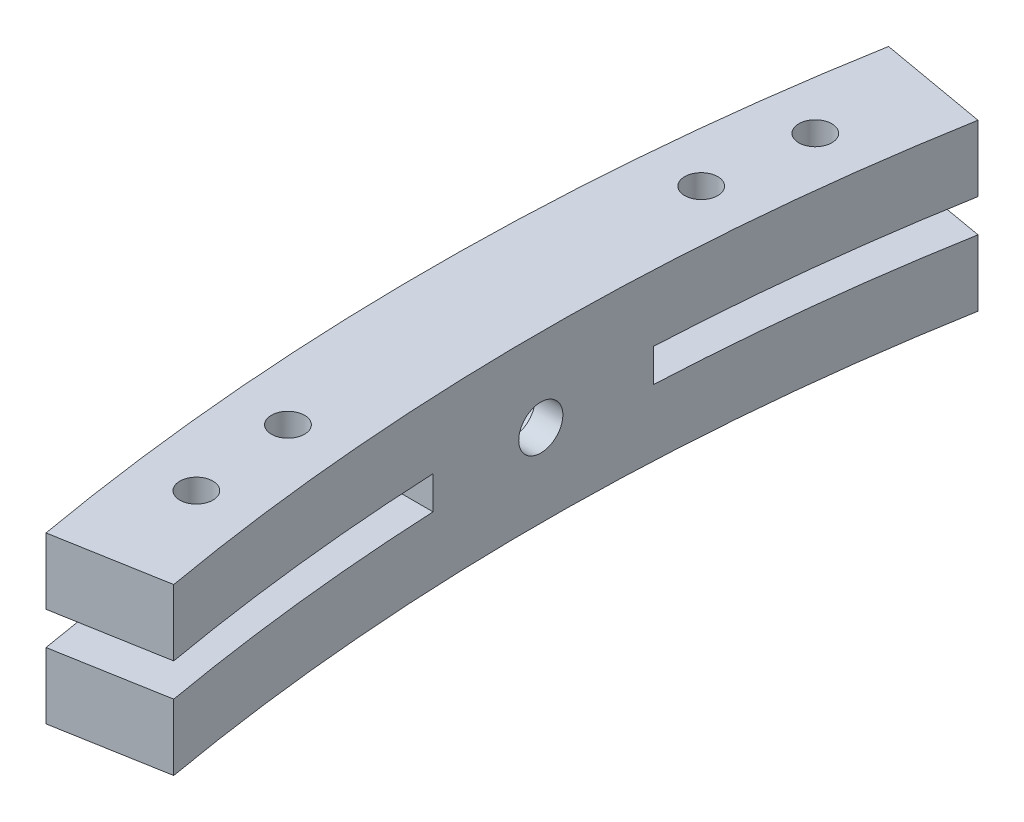
ISO-10303-21;
HEADER;
FILE_DESCRIPTION(('STEP AP214'),'2;1');
FILE_NAME('part.step','',(''),(''),'','','');
FILE_SCHEMA(('AUTOMOTIVE_DESIGN { 1 0 10303 214 1 1 1 1 }'));
ENDSEC;
DATA;
#1=APPLICATION_CONTEXT('core data for automotive mechanical design processes');
#2=APPLICATION_PROTOCOL_DEFINITION('international standard','automotive_design',2000,#1);
#3=PRODUCT_CONTEXT('',#1,'mechanical');
#4=PRODUCT('Part','Part','',(#3));
#5=PRODUCT_RELATED_PRODUCT_CATEGORY('part','',(#4));
#6=PRODUCT_DEFINITION_FORMATION('','',#4);
#7=PRODUCT_DEFINITION_CONTEXT('part definition',#1,'design');
#8=PRODUCT_DEFINITION('design','',#6,#7);
#9=PRODUCT_DEFINITION_SHAPE('','',#8);
#10=(LENGTH_UNIT() NAMED_UNIT(*) SI_UNIT(.MILLI.,.METRE.));
#11=(NAMED_UNIT(*) PLANE_ANGLE_UNIT() SI_UNIT($,.RADIAN.));
#12=(NAMED_UNIT(*) SI_UNIT($,.STERADIAN.) SOLID_ANGLE_UNIT());
#13=UNCERTAINTY_MEASURE_WITH_UNIT(LENGTH_MEASURE(1.E-05),#10,'distance_accuracy_value','');
#14=(GEOMETRIC_REPRESENTATION_CONTEXT(3) GLOBAL_UNCERTAINTY_ASSIGNED_CONTEXT((#13)) GLOBAL_UNIT_ASSIGNED_CONTEXT((#10,
#11,#12)) REPRESENTATION_CONTEXT('',''));
#15=CARTESIAN_POINT('',(0.,0.,0.));
#16=DIRECTION('',(0.,0.,1.));
#17=DIRECTION('',(1.,0.,0.));
#18=AXIS2_PLACEMENT_3D('',#15,#16,#17);
#19=CARTESIAN_POINT('',(-206.809628132564,0.,0.));
#20=DIRECTION('',(-1.,0.,0.));
#21=DIRECTION('',(0.,0.,1.));
#22=AXIS2_PLACEMENT_3D('',#19,#20,#21);
#23=CYLINDRICAL_SURFACE('',#22,2.);
#24=CARTESIAN_POINT('',(-209.990475974507,0.,2.));
#25=CARTESIAN_POINT('',(-209.990476103288,0.112338144724667,1.99999501923187));
#26=CARTESIAN_POINT('',(-209.990567088491,0.224757680341208,1.99050334589177));
#27=CARTESIAN_POINT('',(-209.990921298249,0.44650047140939,1.95277099718324));
#28=CARTESIAN_POINT('',(-209.991184729956,0.555819837775476,1.92450777179201));
#29=CARTESIAN_POINT('',(-209.991853987858,0.768117717352412,1.85003714892444));
#30=CARTESIAN_POINT('',(-209.992259745865,0.871099239304149,1.80383834326234));
#31=CARTESIAN_POINT('',(-209.993167847768,1.06781566271735,1.69481982844648));
#32=CARTESIAN_POINT('',(-209.993670167683,1.16155285127975,1.632004244612));
#33=CARTESIAN_POINT('',(-209.994714901786,1.33716547300706,1.49152048490637));
#34=CARTESIAN_POINT('',(-209.995257321297,1.41903932721294,1.41385033514174));
#35=CARTESIAN_POINT('',(-209.996321070344,1.56858847588184,1.24586395594507));
#36=CARTESIAN_POINT('',(-209.99684239905,1.63626321196187,1.15554722941682));
#37=CARTESIAN_POINT('',(-209.997805168152,1.75548929937188,0.964833609456509));
#38=CARTESIAN_POINT('',(-209.998246608519,1.80704064485505,0.864436712369089));
#39=CARTESIAN_POINT('',(-209.998999830737,1.8925561649259,0.656412867654744));
#40=CARTESIAN_POINT('',(-209.999311612874,1.92652037841772,0.548785936021828));
#41=CARTESIAN_POINT('',(-209.999770361235,1.97589670512903,0.329360353643706));
#42=CARTESIAN_POINT('',(-209.999917332212,1.99130935359541,0.21756182335278));
#43=CARTESIAN_POINT('',(-210.000029904476,2.0031466569911,-0.00703586417104369));
#44=CARTESIAN_POINT('',(-209.999995506128,1.9995713503242,-0.119835019379682));
#45=CARTESIAN_POINT('',(-209.999749222785,1.97353478375664,-0.343228310351627));
#46=CARTESIAN_POINT('',(-209.999537343485,1.95107412981574,-0.453822516746895));
#47=CARTESIAN_POINT('',(-209.998959991412,1.88790536605931,-0.669670442844306));
#48=CARTESIAN_POINT('',(-209.998594518459,1.84719723487059,-0.77492415629099));
#49=CARTESIAN_POINT('',(-209.997751172224,1.74868840391252,-0.977105087984566));
#50=CARTESIAN_POINT('',(-209.997273297124,1.69088742769442,-1.07403217152914));
#51=CARTESIAN_POINT('',(-209.99625902137,1.55983393215372,-1.25680687066725));
#52=CARTESIAN_POINT('',(-209.995722620723,1.48658141489486,-1.34265448774057));
#53=CARTESIAN_POINT('',(-209.994651741146,1.32670076455301,-1.50083691875616));
#54=CARTESIAN_POINT('',(-209.994117262293,1.24007209867148,-1.57317119418147));
#55=CARTESIAN_POINT('',(-209.9931105061,1.0559001501441,-1.70226945291759));
#56=CARTESIAN_POINT('',(-209.992638228767,0.958356866042596,-1.75903343415182));
#57=CARTESIAN_POINT('',(-209.991809123657,0.755124362536577,-1.85537966887152));
#58=CARTESIAN_POINT('',(-209.991452295982,0.649435135854338,-1.89496190700633));
#59=CARTESIAN_POINT('',(-209.990894325096,0.432911079394529,-1.95582069791133));
#60=CARTESIAN_POINT('',(-209.990693181835,0.32207625123683,-1.97709725644425));
#61=CARTESIAN_POINT('',(-209.99046926513,0.0984119228020425,-2.00074005741272));
#62=CARTESIAN_POINT('',(-209.990446484678,-0.0144174989180951,-2.0031070429451));
#63=CARTESIAN_POINT('',(-209.990581843633,-0.238872229036356,-1.98886544114253));
#64=CARTESIAN_POINT('',(-209.990739983027,-0.350497537526149,-1.97225685525221));
#65=CARTESIAN_POINT('',(-209.991219346535,-0.569373267640925,-1.92053619110991));
#66=CARTESIAN_POINT('',(-209.991540567689,-0.676623768615336,-1.8854244486256));
#67=CARTESIAN_POINT('',(-209.992309877271,-0.883707785503045,-1.79769453414193));
#68=CARTESIAN_POINT('',(-209.99275796571,-0.983541300779398,-1.74507636063919));
#69=CARTESIAN_POINT('',(-209.993730508996,-1.17296080105573,-1.62382534240781));
#70=CARTESIAN_POINT('',(-209.994254966224,-1.26254646648596,-1.55519199846361));
#71=CARTESIAN_POINT('',(-209.995321110871,-1.42892402505123,-1.40385963900143));
#72=CARTESIAN_POINT('',(-209.995862798301,-1.50571591024363,-1.32116061475126));
#73=CARTESIAN_POINT('',(-209.996902353189,-1.6443284696106,-1.14404128468044));
#74=CARTESIAN_POINT('',(-209.997400219233,-1.7061486607081,-1.04962060079706));
#75=CARTESIAN_POINT('',(-209.998295980995,-1.81305958966895,-0.851740304049286));
#76=CARTESIAN_POINT('',(-209.99869387683,-1.85815034721909,-0.748280701821836));
#77=CARTESIAN_POINT('',(-209.999344832952,-1.93032164857358,-0.535261248056988));
#78=CARTESIAN_POINT('',(-209.999597895796,-1.95740251045758,-0.425701504293564));
#79=CARTESIAN_POINT('',(-209.999930665911,-1.9927863528557,-0.20359011662296));
#80=CARTESIAN_POINT('',(-210.000010372916,-2.00108930459758,-0.0910384681317369));
#81=CARTESIAN_POINT('',(-209.999987444478,-1.99868151517294,0.133856563992748));
#82=CARTESIAN_POINT('',(-209.999884816589,-1.98797156168879,0.246199956060809));
#83=CARTESIAN_POINT('',(-209.99950880268,-1.9478435448965,0.467494268922846));
#84=CARTESIAN_POINT('',(-209.999235416317,-1.91842544401415,0.576445182902772));
#85=CARTESIAN_POINT('',(-209.9985486987,-1.84171571347673,0.787863607565823));
#86=CARTESIAN_POINT('',(-209.998135364851,-1.79442375244774,0.890330998006005));
#87=CARTESIAN_POINT('',(-209.997215368816,-1.68331083924546,1.08586790640008));
#88=CARTESIAN_POINT('',(-209.996708710266,-1.61949053091215,1.17893779022522));
#89=CARTESIAN_POINT('',(-209.995659200466,-1.47713719378852,1.35303707824784));
#90=CARTESIAN_POINT('',(-209.995116351574,-1.39860512240719,1.43406726534718));
#91=CARTESIAN_POINT('',(-209.99405548637,-1.22902900590704,1.58181384760612));
#92=CARTESIAN_POINT('',(-209.993537476263,-1.13798185698451,1.64852668144316));
#93=CARTESIAN_POINT('',(-209.992584603694,-0.945942267430312,1.76574633816794));
#94=CARTESIAN_POINT('',(-209.992149782485,-0.844944930075764,1.81624512915293));
#95=CARTESIAN_POINT('',(-209.991413171647,-0.635984384433633,1.89951164659267));
#96=CARTESIAN_POINT('',(-209.991111222704,-0.52802969718172,1.93230061804755));
#97=CARTESIAN_POINT('',(-209.990755503972,-0.349489679392705,1.97048274438937));
#98=CARTESIAN_POINT('',(-209.990651132381,-0.28006434017606,1.98153788954919));
#99=CARTESIAN_POINT('',(-209.990511327393,-0.140436605301862,1.99629807424471));
#100=CARTESIAN_POINT('',(-209.990475893993,-0.0702342096668952,2.00000311399404));
#101=CARTESIAN_POINT('',(-209.990475974507,0.,2.));
#102=B_SPLINE_CURVE_WITH_KNOTS('',3,(#24,#25,#26,#27,#28,#29,#30,#31,#32,#33,#34,#35,#36,#37,
#38,#39,#40,#41,#42,#43,#44,#45,#46,#47,#48,#49,#50,#51,#52,#53,#54,#55,#56,#57,#58,#59,#60,#61,
#62,#63,#64,#65,#66,#67,#68,#69,#70,#71,#72,#73,#74,#75,#76,#77,#78,#79,#80,#81,#82,#83,#84,#85,
#86,#87,#88,#89,#90,#91,#92,#93,#94,#95,#96,#97,#98,#99,#100,#101),.UNSPECIFIED.,.T.,.F.,(4,2,2,
2,2,2,2,2,2,2,2,2,2,2,2,2,2,2,2,2,2,2,2,2,2,2,2,2,2,2,2,2,2,2,2,2,2,2,4),(0.,0.33675807856215,
0.673921433723593,1.01092347391729,1.34784192760651,1.68480518259074,2.0217816862357,
2.35875831207826,2.69573419249842,3.03270035030923,3.36966582659441,3.70662049133727,
4.04357555075471,4.38053606016596,4.71749652457234,5.05447041424717,5.39144434886357,
5.72841858454169,6.06539271413871,6.40235360146759,6.73931446314333,7.07626921036691,
7.41322398652699,7.75018926744835,8.08715475756382,8.4241311187685,8.76110708342643,
9.09807709646478,9.43504762582103,9.77200419520907,10.1089614413563,10.4459249348569,
10.7828753043629,11.1198037534967,11.4568159138925,11.793994762363,12.1307682218808,
12.341310582556,12.5518529371118),.UNSPECIFIED.);
#103=CARTESIAN_POINT('',(-209.990475974507,0.,2.));
#104=VERTEX_POINT('',#103);
#105=EDGE_CURVE('E236',#104,#104,#102,.T.);
#106=ORIENTED_EDGE('',*,*,#105,.F.);
#107=EDGE_LOOP('',(#106));
#108=FACE_BOUND('',#107,.T.);
#109=CARTESIAN_POINT('',(-212.5,0.,0.));
#110=DIRECTION('',(-1.,0.,0.));
#111=DIRECTION('',(0.,0.,1.));
#112=AXIS2_PLACEMENT_3D('',#109,#110,#111);
#113=CIRCLE('',#112,2.);
#114=CARTESIAN_POINT('',(-212.5,0.,2.));
#115=VERTEX_POINT('',#114);
#116=EDGE_CURVE('E39',#115,#115,#113,.T.);
#117=ORIENTED_EDGE('',*,*,#116,.T.);
#118=EDGE_LOOP('',(#117));
#119=FACE_BOUND('',#118,.T.);
#120=ADVANCED_FACE('F34',(#108,#119),#23,.F.);
#121=CARTESIAN_POINT('',(0.,7.5,0.));
#122=DIRECTION('',(0.,-1.,0.));
#123=DIRECTION('',(0.,0.,-1.));
#124=AXIS2_PLACEMENT_3D('',#121,#122,#123);
#125=CYLINDRICAL_SURFACE('',#124,210.);
#126=CARTESIAN_POINT('',(0.,1.5,0.));
#127=DIRECTION('',(0.,1.,0.));
#128=DIRECTION('',(0.,0.,1.));
#129=AXIS2_PLACEMENT_3D('',#126,#127,#128);
#130=CIRCLE('',#129,210.);
#131=CARTESIAN_POINT('',(-209.76176963403,1.5,10.));
#132=VERTEX_POINT('',#131);
#133=CARTESIAN_POINT('',(-206.809628132564,1.5,36.4661173100555));
#134=VERTEX_POINT('',#133);
#135=EDGE_CURVE('E160',#132,#134,#130,.T.);
#136=ORIENTED_EDGE('',*,*,#135,.F.);
#137=DIRECTION('',(0.,-1.,0.));
#138=VECTOR('',#137,1.);
#139=CARTESIAN_POINT('',(-209.76176963403,32.5390961188828,10.));
#140=LINE('',#139,#138);
#141=CARTESIAN_POINT('',(-209.76176963403,-1.5,10.));
#142=VERTEX_POINT('',#141);
#143=EDGE_CURVE('E138',#132,#142,#140,.T.);
#144=ORIENTED_EDGE('',*,*,#143,.T.);
#145=CARTESIAN_POINT('',(0.,-1.5,0.));
#146=DIRECTION('',(0.,1.,0.));
#147=DIRECTION('',(0.,0.,1.));
#148=AXIS2_PLACEMENT_3D('',#145,#146,#147);
#149=CIRCLE('',#148,210.);
#150=CARTESIAN_POINT('',(-206.809628132564,-1.5,36.4661173100554));
#151=VERTEX_POINT('',#150);
#152=EDGE_CURVE('E142',#142,#151,#149,.T.);
#153=ORIENTED_EDGE('',*,*,#152,.T.);
#154=DIRECTION('',(0.,-1.,0.));
#155=VECTOR('',#154,1.);
#156=CARTESIAN_POINT('',(-206.809628132564,7.5,36.4661173100555));
#157=LINE('',#156,#155);
#158=CARTESIAN_POINT('',(-206.809628132564,-7.5,36.4661173100555));
#159=VERTEX_POINT('',#158);
#160=EDGE_CURVE('E201',#151,#159,#157,.T.);
#161=ORIENTED_EDGE('',*,*,#160,.T.);
#162=CARTESIAN_POINT('',(0.,-7.5,0.));
#163=DIRECTION('',(0.,1.,0.));
#164=DIRECTION('',(0.,0.,1.));
#165=AXIS2_PLACEMENT_3D('',#162,#163,#164);
#166=CIRCLE('',#165,210.);
#167=CARTESIAN_POINT('',(-206.809628132564,-7.5,-36.4661173100555));
#168=VERTEX_POINT('',#167);
#169=EDGE_CURVE('E164',#168,#159,#166,.T.);
#170=ORIENTED_EDGE('',*,*,#169,.F.);
#171=DIRECTION('',(0.,-1.,0.));
#172=VECTOR('',#171,1.);
#173=CARTESIAN_POINT('',(-206.809628132564,7.5,-36.4661173100555));
#174=LINE('',#173,#172);
#175=CARTESIAN_POINT('',(-206.809628132564,-1.5,-36.4661173100554));
#176=VERTEX_POINT('',#175);
#177=EDGE_CURVE('E44',#176,#168,#174,.T.);
#178=ORIENTED_EDGE('',*,*,#177,.F.);
#179=CARTESIAN_POINT('',(0.,-1.5,0.));
#180=DIRECTION('',(0.,1.,0.));
#181=DIRECTION('',(0.,0.,1.));
#182=AXIS2_PLACEMENT_3D('',#179,#180,#181);
#183=CIRCLE('',#182,210.);
#184=CARTESIAN_POINT('',(-209.76176963403,-1.5,-10.));
#185=VERTEX_POINT('',#184);
#186=EDGE_CURVE('E173',#176,#185,#183,.T.);
#187=ORIENTED_EDGE('',*,*,#186,.T.);
#188=DIRECTION('',(0.,-1.,0.));
#189=VECTOR('',#188,1.);
#190=CARTESIAN_POINT('',(-209.76176963403,32.5390961188828,-10.));
#191=LINE('',#190,#189);
#192=CARTESIAN_POINT('',(-209.76176963403,1.5,-10.));
#193=VERTEX_POINT('',#192);
#194=EDGE_CURVE('E176',#193,#185,#191,.T.);
#195=ORIENTED_EDGE('',*,*,#194,.F.);
#196=CARTESIAN_POINT('',(0.,1.5,0.));
#197=DIRECTION('',(0.,1.,0.));
#198=DIRECTION('',(0.,0.,1.));
#199=AXIS2_PLACEMENT_3D('',#196,#197,#198);
#200=CIRCLE('',#199,210.);
#201=CARTESIAN_POINT('',(-206.809628132564,1.5,-36.4661173100554));
#202=VERTEX_POINT('',#201);
#203=EDGE_CURVE('E180',#193,#202,#200,.F.);
#204=ORIENTED_EDGE('',*,*,#203,.T.);
#205=CARTESIAN_POINT('',(-206.809628132564,7.5,-36.4661173100555));
#206=VERTEX_POINT('',#205);
#207=EDGE_CURVE('E11',#206,#202,#174,.T.);
#208=ORIENTED_EDGE('',*,*,#207,.F.);
#209=CARTESIAN_POINT('',(0.,7.5,0.));
#210=DIRECTION('',(0.,1.,0.));
#211=DIRECTION('',(0.,0.,1.));
#212=AXIS2_PLACEMENT_3D('',#209,#210,#211);
#213=CIRCLE('',#212,210.);
#214=CARTESIAN_POINT('',(-206.809628132564,7.5,36.4661173100555));
#215=VERTEX_POINT('',#214);
#216=EDGE_CURVE('E190',#206,#215,#213,.T.);
#217=ORIENTED_EDGE('',*,*,#216,.T.);
#218=EDGE_CURVE('E211',#215,#134,#157,.T.);
#219=ORIENTED_EDGE('',*,*,#218,.T.);
#220=EDGE_LOOP('',(#136,#144,#153,#161,#170,#178,#187,#195,#204,#208,#217,#219));
#221=FACE_BOUND('',#220,.T.);
#222=ORIENTED_EDGE('',*,*,#105,.T.);
#223=EDGE_LOOP('',(#222));
#224=FACE_BOUND('',#223,.T.);
#225=ADVANCED_FACE('F36',(#221,#224),#125,.F.);
#226=CARTESIAN_POINT('',(0.,7.5,0.));
#227=DIRECTION('',(-0.173648177666931,0.,0.984807753012208));
#228=DIRECTION('',(0.984807753012208,0.,0.173648177666931));
#229=AXIS2_PLACEMENT_3D('',#226,#227,#228);
#230=PLANE('',#229);
#231=DIRECTION('',(0.984807753012208,0.,0.17364817766693));
#232=VECTOR('',#231,1.);
#233=CARTESIAN_POINT('',(-206.809628132564,-1.5,-36.4661173100554));
#234=LINE('',#233,#232);
#235=CARTESIAN_POINT('',(-216.657705662686,-1.5,-38.2025990867248));
#236=VERTEX_POINT('',#235);
#237=EDGE_CURVE('E52',#236,#176,#234,.T.);
#238=ORIENTED_EDGE('',*,*,#237,.T.);
#239=ORIENTED_EDGE('',*,*,#177,.T.);
#240=DIRECTION('',(-0.984807753012208,0.,-0.173648177666931));
#241=VECTOR('',#240,1.);
#242=CARTESIAN_POINT('',(0.,-7.5,0.));
#243=LINE('',#242,#241);
#244=CARTESIAN_POINT('',(-216.657705662686,-7.5,-38.2025990867248));
#245=VERTEX_POINT('',#244);
#246=EDGE_CURVE('E204',#168,#245,#243,.T.);
#247=ORIENTED_EDGE('',*,*,#246,.T.);
#248=DIRECTION('',(0.,-1.,0.));
#249=VECTOR('',#248,1.);
#250=CARTESIAN_POINT('',(-216.657705662686,7.5,-38.2025990867248));
#251=LINE('',#250,#249);
#252=EDGE_CURVE('E217',#236,#245,#251,.T.);
#253=ORIENTED_EDGE('',*,*,#252,.F.);
#254=EDGE_LOOP('',(#238,#239,#247,#253));
#255=FACE_BOUND('',#254,.T.);
#256=ADVANCED_FACE('F308',(#255),#230,.F.);
#257=CARTESIAN_POINT('',(0.,7.5,0.));
#258=DIRECTION('',(0.173648177666931,0.,0.984807753012208));
#259=DIRECTION('',(0.984807753012208,0.,-0.173648177666931));
#260=AXIS2_PLACEMENT_3D('',#257,#258,#259);
#261=PLANE('',#260);
#262=ORIENTED_EDGE('',*,*,#160,.F.);
#263=DIRECTION('',(-0.984807753012208,0.,0.17364817766693));
#264=VECTOR('',#263,1.);
#265=CARTESIAN_POINT('',(-206.809628132564,-1.5,36.4661173100554));
#266=LINE('',#265,#264);
#267=CARTESIAN_POINT('',(-216.657705662686,-1.5,38.2025990867248));
#268=VERTEX_POINT('',#267);
#269=EDGE_CURVE('E157',#151,#268,#266,.T.);
#270=ORIENTED_EDGE('',*,*,#269,.T.);
#271=DIRECTION('',(0.,-1.,0.));
#272=VECTOR('',#271,1.);
#273=CARTESIAN_POINT('',(-216.657705662686,7.5,38.2025990867248));
#274=LINE('',#273,#272);
#275=CARTESIAN_POINT('',(-216.657705662686,-7.5,38.2025990867248));
#276=VERTEX_POINT('',#275);
#277=EDGE_CURVE('E147',#268,#276,#274,.T.);
#278=ORIENTED_EDGE('',*,*,#277,.T.);
#279=DIRECTION('',(-0.984807753012208,0.,0.173648177666931));
#280=VECTOR('',#279,1.);
#281=CARTESIAN_POINT('',(0.,-7.5,0.));
#282=LINE('',#281,#280);
#283=EDGE_CURVE('E194',#159,#276,#282,.T.);
#284=ORIENTED_EDGE('',*,*,#283,.F.);
#285=EDGE_LOOP('',(#262,#270,#278,#284));
#286=FACE_BOUND('',#285,.T.);
#287=ADVANCED_FACE('F303',(#286),#261,.T.);
#288=ORIENTED_EDGE('',*,*,#207,.T.);
#289=DIRECTION('',(-0.984807753012208,0.,-0.17364817766693));
#290=VECTOR('',#289,1.);
#291=CARTESIAN_POINT('',(-206.809628132564,1.5,-36.4661173100554));
#292=LINE('',#291,#290);
#293=CARTESIAN_POINT('',(-216.657705662686,1.5,-38.2025990867249));
#294=VERTEX_POINT('',#293);
#295=EDGE_CURVE('E151',#202,#294,#292,.T.);
#296=ORIENTED_EDGE('',*,*,#295,.T.);
#297=CARTESIAN_POINT('',(-216.657705662686,7.5,-38.2025990867248));
#298=VERTEX_POINT('',#297);
#299=EDGE_CURVE('E218',#298,#294,#251,.T.);
#300=ORIENTED_EDGE('',*,*,#299,.F.);
#301=DIRECTION('',(-0.984807753012208,0.,-0.173648177666931));
#302=VECTOR('',#301,1.);
#303=CARTESIAN_POINT('',(0.,7.5,0.));
#304=LINE('',#303,#302);
#305=EDGE_CURVE('E193',#206,#298,#304,.T.);
#306=ORIENTED_EDGE('',*,*,#305,.F.);
#307=EDGE_LOOP('',(#288,#296,#300,#306));
#308=FACE_BOUND('',#307,.T.);
#309=ADVANCED_FACE('F305',(#308),#230,.F.);
#310=CARTESIAN_POINT('',(0.,7.5,0.));
#311=DIRECTION('',(0.,-1.,0.));
#312=DIRECTION('',(0.,0.,-1.));
#313=AXIS2_PLACEMENT_3D('',#310,#311,#312);
#314=CYLINDRICAL_SURFACE('',#313,220.);
#315=DIRECTION('',(0.,-1.,0.));
#316=VECTOR('',#315,1.);
#317=CARTESIAN_POINT('',(-219.772609758359,32.5390961188828,10.));
#318=LINE('',#317,#316);
#319=CARTESIAN_POINT('',(-219.772609758359,1.5,10.));
#320=VERTEX_POINT('',#319);
#321=CARTESIAN_POINT('',(-219.772609758359,-1.5,10.));
#322=VERTEX_POINT('',#321);
#323=EDGE_CURVE('E129',#320,#322,#318,.T.);
#324=ORIENTED_EDGE('',*,*,#323,.F.);
#325=CARTESIAN_POINT('',(0.,1.5,0.));
#326=DIRECTION('',(0.,1.,0.));
#327=DIRECTION('',(0.,0.,1.));
#328=AXIS2_PLACEMENT_3D('',#325,#326,#327);
#329=CIRCLE('',#328,220.);
#330=CARTESIAN_POINT('',(-216.657705662686,1.5,38.2025990867246));
#331=VERTEX_POINT('',#330);
#332=EDGE_CURVE('E137',#320,#331,#329,.T.);
#333=ORIENTED_EDGE('',*,*,#332,.T.);
#334=CARTESIAN_POINT('',(-216.657705662686,7.5,38.2025990867248));
#335=VERTEX_POINT('',#334);
#336=EDGE_CURVE('E214',#335,#331,#274,.T.);
#337=ORIENTED_EDGE('',*,*,#336,.F.);
#338=CARTESIAN_POINT('',(0.,7.5,0.));
#339=DIRECTION('',(0.,1.,0.));
#340=DIRECTION('',(0.,0.,1.));
#341=AXIS2_PLACEMENT_3D('',#338,#339,#340);
#342=CIRCLE('',#341,220.);
#343=EDGE_CURVE('E196',#298,#335,#342,.T.);
#344=ORIENTED_EDGE('',*,*,#343,.F.);
#345=ORIENTED_EDGE('',*,*,#299,.T.);
#346=CARTESIAN_POINT('',(0.,1.5,0.));
#347=DIRECTION('',(0.,1.,0.));
#348=DIRECTION('',(0.,0.,1.));
#349=AXIS2_PLACEMENT_3D('',#346,#347,#348);
#350=CIRCLE('',#349,220.);
#351=CARTESIAN_POINT('',(-219.772609758359,1.5,-10.));
#352=VERTEX_POINT('',#351);
#353=EDGE_CURVE('E148',#294,#352,#350,.T.);
#354=ORIENTED_EDGE('',*,*,#353,.T.);
#355=DIRECTION('',(0.,-1.,0.));
#356=VECTOR('',#355,1.);
#357=CARTESIAN_POINT('',(-219.772609758359,32.5390961188828,-10.));
#358=LINE('',#357,#356);
#359=CARTESIAN_POINT('',(-219.772609758359,-1.5,-10.));
#360=VERTEX_POINT('',#359);
#361=EDGE_CURVE('E186',#352,#360,#358,.T.);
#362=ORIENTED_EDGE('',*,*,#361,.T.);
#363=CARTESIAN_POINT('',(0.,-1.5,0.));
#364=DIRECTION('',(0.,1.,0.));
#365=DIRECTION('',(0.,0.,1.));
#366=AXIS2_PLACEMENT_3D('',#363,#364,#365);
#367=CIRCLE('',#366,220.);
#368=EDGE_CURVE('E169',#360,#236,#367,.F.);
#369=ORIENTED_EDGE('',*,*,#368,.T.);
#370=ORIENTED_EDGE('',*,*,#252,.T.);
#371=CARTESIAN_POINT('',(0.,-7.5,0.));
#372=DIRECTION('',(0.,1.,0.));
#373=DIRECTION('',(0.,0.,1.));
#374=AXIS2_PLACEMENT_3D('',#371,#372,#373);
#375=CIRCLE('',#374,220.);
#376=EDGE_CURVE('E207',#245,#276,#375,.T.);
#377=ORIENTED_EDGE('',*,*,#376,.T.);
#378=ORIENTED_EDGE('',*,*,#277,.F.);
#379=CARTESIAN_POINT('',(0.,-1.5,0.));
#380=DIRECTION('',(0.,1.,0.));
#381=DIRECTION('',(0.,0.,1.));
#382=AXIS2_PLACEMENT_3D('',#379,#380,#381);
#383=CIRCLE('',#382,220.);
#384=EDGE_CURVE('E60',#322,#268,#383,.T.);
#385=ORIENTED_EDGE('',*,*,#384,.F.);
#386=EDGE_LOOP('',(#324,#333,#337,#344,#345,#354,#362,#369,#370,#377,#378,#385));
#387=FACE_BOUND('',#386,.T.);
#388=ADVANCED_FACE('F145',(#387),#314,.T.);
#389=DIRECTION('',(0.984807753012208,0.,-0.17364817766693));
#390=VECTOR('',#389,1.);
#391=CARTESIAN_POINT('',(-206.809628132564,1.5,36.4661173100554));
#392=LINE('',#391,#390);
#393=EDGE_CURVE('E162',#331,#134,#392,.T.);
#394=ORIENTED_EDGE('',*,*,#393,.T.);
#395=ORIENTED_EDGE('',*,*,#218,.F.);
#396=DIRECTION('',(-0.984807753012208,0.,0.173648177666931));
#397=VECTOR('',#396,1.);
#398=CARTESIAN_POINT('',(0.,7.5,0.));
#399=LINE('',#398,#397);
#400=EDGE_CURVE('E198',#215,#335,#399,.T.);
#401=ORIENTED_EDGE('',*,*,#400,.T.);
#402=ORIENTED_EDGE('',*,*,#336,.T.);
#403=EDGE_LOOP('',(#394,#395,#401,#402));
#404=FACE_BOUND('',#403,.T.);
#405=ADVANCED_FACE('F295',(#404),#261,.T.);
#406=CARTESIAN_POINT('',(0.,7.5,0.));
#407=DIRECTION('',(0.,1.,0.));
#408=DIRECTION('',(0.,0.,1.));
#409=AXIS2_PLACEMENT_3D('',#406,#407,#408);
#410=PLANE('',#409);
#411=CARTESIAN_POINT('',(-213.160645195369,7.5,-28.0631313273113));
#412=DIRECTION('',(0.,1.,0.));
#413=DIRECTION('',(0.,0.,1.));
#414=AXIS2_PLACEMENT_3D('',#411,#412,#413);
#415=CIRCLE('',#414,1.5);
#416=CARTESIAN_POINT('',(-213.160645195369,7.5,-26.5631313273113));
#417=VERTEX_POINT('',#416);
#418=EDGE_CURVE('E355',#417,#417,#415,.T.);
#419=ORIENTED_EDGE('',*,*,#418,.F.);
#420=EDGE_LOOP('',(#419));
#421=FACE_BOUND('',#420,.T.);
#422=CARTESIAN_POINT('',(-214.181860089725,7.5,-18.7384846907465));
#423=DIRECTION('',(0.,1.,0.));
#424=DIRECTION('',(0.,0.,1.));
#425=AXIS2_PLACEMENT_3D('',#422,#423,#424);
#426=CIRCLE('',#425,1.5);
#427=CARTESIAN_POINT('',(-214.181860089725,7.5,-17.2384846907465));
#428=VERTEX_POINT('',#427);
#429=EDGE_CURVE('E361',#428,#428,#426,.T.);
#430=ORIENTED_EDGE('',*,*,#429,.F.);
#431=EDGE_LOOP('',(#430));
#432=FACE_BOUND('',#431,.T.);
#433=CARTESIAN_POINT('',(-214.181860089725,7.5,18.7384846907466));
#434=DIRECTION('',(0.,1.,0.));
#435=DIRECTION('',(0.,0.,-1.));
#436=AXIS2_PLACEMENT_3D('',#433,#434,#435);
#437=CIRCLE('',#436,1.5);
#438=CARTESIAN_POINT('',(-214.181860089725,7.5,17.2384846907466));
#439=VERTEX_POINT('',#438);
#440=EDGE_CURVE('E367',#439,#439,#437,.T.);
#441=ORIENTED_EDGE('',*,*,#440,.F.);
#442=EDGE_LOOP('',(#441));
#443=FACE_BOUND('',#442,.T.);
#444=CARTESIAN_POINT('',(-213.160645195369,7.5,28.0631313273113));
#445=DIRECTION('',(0.,1.,0.));
#446=DIRECTION('',(0.,0.,-1.));
#447=AXIS2_PLACEMENT_3D('',#444,#445,#446);
#448=CIRCLE('',#447,1.5);
#449=CARTESIAN_POINT('',(-213.160645195369,7.5,26.5631313273113));
#450=VERTEX_POINT('',#449);
#451=EDGE_CURVE('E242',#450,#450,#448,.T.);
#452=ORIENTED_EDGE('',*,*,#451,.F.);
#453=EDGE_LOOP('',(#452));
#454=FACE_BOUND('',#453,.T.);
#455=ORIENTED_EDGE('',*,*,#216,.F.);
#456=ORIENTED_EDGE('',*,*,#305,.T.);
#457=ORIENTED_EDGE('',*,*,#343,.T.);
#458=ORIENTED_EDGE('',*,*,#400,.F.);
#459=EDGE_LOOP('',(#455,#456,#457,#458));
#460=FACE_BOUND('',#459,.T.);
#461=ADVANCED_FACE('F292',(#421,#432,#443,#454,#460),#410,.T.);
#462=CARTESIAN_POINT('',(0.,-7.5,0.));
#463=DIRECTION('',(0.,1.,0.));
#464=DIRECTION('',(0.,0.,1.));
#465=AXIS2_PLACEMENT_3D('',#462,#463,#464);
#466=PLANE('',#465);
#467=CARTESIAN_POINT('',(-213.160645195369,-7.5,-28.0631313273113));
#468=DIRECTION('',(0.,1.,0.));
#469=DIRECTION('',(0.,0.,1.));
#470=AXIS2_PLACEMENT_3D('',#467,#468,#469);
#471=CIRCLE('',#470,1.5);
#472=CARTESIAN_POINT('',(-213.160645195369,-7.5,-26.5631313273113));
#473=VERTEX_POINT('',#472);
#474=EDGE_CURVE('E225',#473,#473,#471,.T.);
#475=ORIENTED_EDGE('',*,*,#474,.T.);
#476=EDGE_LOOP('',(#475));
#477=FACE_BOUND('',#476,.T.);
#478=CARTESIAN_POINT('',(-214.181860089725,-7.5,-18.7384846907465));
#479=DIRECTION('',(0.,1.,0.));
#480=DIRECTION('',(0.,0.,1.));
#481=AXIS2_PLACEMENT_3D('',#478,#479,#480);
#482=CIRCLE('',#481,1.5);
#483=CARTESIAN_POINT('',(-214.181860089725,-7.5,-17.2384846907465));
#484=VERTEX_POINT('',#483);
#485=EDGE_CURVE('E358',#484,#484,#482,.T.);
#486=ORIENTED_EDGE('',*,*,#485,.T.);
#487=EDGE_LOOP('',(#486));
#488=FACE_BOUND('',#487,.T.);
#489=CARTESIAN_POINT('',(-214.181860089725,-7.5,18.7384846907466));
#490=DIRECTION('',(0.,1.,0.));
#491=DIRECTION('',(0.,0.,-1.));
#492=AXIS2_PLACEMENT_3D('',#489,#490,#491);
#493=CIRCLE('',#492,1.5);
#494=CARTESIAN_POINT('',(-214.181860089725,-7.5,17.2384846907466));
#495=VERTEX_POINT('',#494);
#496=EDGE_CURVE('E364',#495,#495,#493,.T.);
#497=ORIENTED_EDGE('',*,*,#496,.T.);
#498=EDGE_LOOP('',(#497));
#499=FACE_BOUND('',#498,.T.);
#500=CARTESIAN_POINT('',(-213.160645195369,-7.5,28.0631313273113));
#501=DIRECTION('',(0.,1.,0.));
#502=DIRECTION('',(0.,0.,-1.));
#503=AXIS2_PLACEMENT_3D('',#500,#501,#502);
#504=CIRCLE('',#503,1.5);
#505=CARTESIAN_POINT('',(-213.160645195369,-7.5,26.5631313273113));
#506=VERTEX_POINT('',#505);
#507=EDGE_CURVE('E370',#506,#506,#504,.T.);
#508=ORIENTED_EDGE('',*,*,#507,.T.);
#509=EDGE_LOOP('',(#508));
#510=FACE_BOUND('',#509,.T.);
#511=ORIENTED_EDGE('',*,*,#169,.T.);
#512=ORIENTED_EDGE('',*,*,#283,.T.);
#513=ORIENTED_EDGE('',*,*,#376,.F.);
#514=ORIENTED_EDGE('',*,*,#246,.F.);
#515=EDGE_LOOP('',(#511,#512,#513,#514));
#516=FACE_BOUND('',#515,.T.);
#517=ADVANCED_FACE('F278',(#477,#488,#499,#510,#516),#466,.F.);
#518=CARTESIAN_POINT('',(-209.76176963403,32.5390961188828,10.));
#519=DIRECTION('',(0.,0.,1.));
#520=DIRECTION('',(1.,0.,0.));
#521=AXIS2_PLACEMENT_3D('',#518,#519,#520);
#522=PLANE('',#521);
#523=DIRECTION('',(-1.,0.,0.));
#524=VECTOR('',#523,1.);
#525=CARTESIAN_POINT('',(220.,1.5,10.));
#526=LINE('',#525,#524);
#527=EDGE_CURVE('E134',#132,#320,#526,.T.);
#528=ORIENTED_EDGE('',*,*,#527,.T.);
#529=ORIENTED_EDGE('',*,*,#323,.T.);
#530=DIRECTION('',(-1.,0.,0.));
#531=VECTOR('',#530,1.);
#532=CARTESIAN_POINT('',(220.,-1.5,10.));
#533=LINE('',#532,#531);
#534=EDGE_CURVE('E132',#142,#322,#533,.T.);
#535=ORIENTED_EDGE('',*,*,#534,.F.);
#536=ORIENTED_EDGE('',*,*,#143,.F.);
#537=EDGE_LOOP('',(#528,#529,#535,#536));
#538=FACE_BOUND('',#537,.T.);
#539=ADVANCED_FACE('F130',(#538),#522,.T.);
#540=CARTESIAN_POINT('',(0.,1.5,0.));
#541=DIRECTION('',(0.,1.,0.));
#542=DIRECTION('',(0.,0.,1.));
#543=AXIS2_PLACEMENT_3D('',#540,#541,#542);
#544=PLANE('',#543);
#545=CARTESIAN_POINT('',(-214.181860089725,1.5,18.7384846907466));
#546=DIRECTION('',(0.,1.,0.));
#547=DIRECTION('',(0.,0.,1.));
#548=AXIS2_PLACEMENT_3D('',#545,#546,#547);
#549=CIRCLE('',#548,1.5);
#550=CARTESIAN_POINT('',(-214.181860089725,1.5,20.2384846907466));
#551=VERTEX_POINT('',#550);
#552=EDGE_CURVE('E155',#551,#551,#549,.T.);
#553=ORIENTED_EDGE('',*,*,#552,.T.);
#554=EDGE_LOOP('',(#553));
#555=FACE_BOUND('',#554,.T.);
#556=CARTESIAN_POINT('',(-213.160645195369,1.5,28.0631313273113));
#557=DIRECTION('',(0.,1.,0.));
#558=DIRECTION('',(0.,0.,1.));
#559=AXIS2_PLACEMENT_3D('',#556,#557,#558);
#560=CIRCLE('',#559,1.5);
#561=CARTESIAN_POINT('',(-213.160645195369,1.5,29.5631313273113));
#562=VERTEX_POINT('',#561);
#563=EDGE_CURVE('E233',#562,#562,#560,.T.);
#564=ORIENTED_EDGE('',*,*,#563,.T.);
#565=EDGE_LOOP('',(#564));
#566=FACE_BOUND('',#565,.T.);
#567=ORIENTED_EDGE('',*,*,#332,.F.);
#568=ORIENTED_EDGE('',*,*,#527,.F.);
#569=ORIENTED_EDGE('',*,*,#135,.T.);
#570=ORIENTED_EDGE('',*,*,#393,.F.);
#571=EDGE_LOOP('',(#567,#568,#569,#570));
#572=FACE_BOUND('',#571,.T.);
#573=ADVANCED_FACE('F274',(#555,#566,#572),#544,.F.);
#574=CARTESIAN_POINT('',(0.,-1.5,0.));
#575=DIRECTION('',(0.,1.,0.));
#576=DIRECTION('',(0.,0.,1.));
#577=AXIS2_PLACEMENT_3D('',#574,#575,#576);
#578=PLANE('',#577);
#579=CARTESIAN_POINT('',(-214.181860089725,-1.5,18.7384846907466));
#580=DIRECTION('',(0.,1.,0.));
#581=DIRECTION('',(0.,0.,1.));
#582=AXIS2_PLACEMENT_3D('',#579,#580,#581);
#583=CIRCLE('',#582,1.5);
#584=CARTESIAN_POINT('',(-214.181860089725,-1.5,20.2384846907466));
#585=VERTEX_POINT('',#584);
#586=EDGE_CURVE('E234',#585,#585,#583,.T.);
#587=ORIENTED_EDGE('',*,*,#586,.F.);
#588=EDGE_LOOP('',(#587));
#589=FACE_BOUND('',#588,.T.);
#590=CARTESIAN_POINT('',(-213.160645195369,-1.5,28.0631313273113));
#591=DIRECTION('',(0.,1.,0.));
#592=DIRECTION('',(0.,0.,1.));
#593=AXIS2_PLACEMENT_3D('',#590,#591,#592);
#594=CIRCLE('',#593,1.5);
#595=CARTESIAN_POINT('',(-213.160645195369,-1.5,29.5631313273113));
#596=VERTEX_POINT('',#595);
#597=EDGE_CURVE('E230',#596,#596,#594,.T.);
#598=ORIENTED_EDGE('',*,*,#597,.F.);
#599=EDGE_LOOP('',(#598));
#600=FACE_BOUND('',#599,.T.);
#601=ORIENTED_EDGE('',*,*,#152,.F.);
#602=ORIENTED_EDGE('',*,*,#534,.T.);
#603=ORIENTED_EDGE('',*,*,#384,.T.);
#604=ORIENTED_EDGE('',*,*,#269,.F.);
#605=EDGE_LOOP('',(#601,#602,#603,#604));
#606=FACE_BOUND('',#605,.T.);
#607=ADVANCED_FACE('F140',(#589,#600,#606),#578,.T.);
#608=CARTESIAN_POINT('',(-209.76176963403,32.5390961188828,-10.));
#609=DIRECTION('',(0.,0.,-1.));
#610=DIRECTION('',(-1.,0.,0.));
#611=AXIS2_PLACEMENT_3D('',#608,#609,#610);
#612=PLANE('',#611);
#613=DIRECTION('',(1.,0.,0.));
#614=VECTOR('',#613,1.);
#615=CARTESIAN_POINT('',(-209.76176963403,1.5,-10.));
#616=LINE('',#615,#614);
#617=EDGE_CURVE('E183',#352,#193,#616,.T.);
#618=ORIENTED_EDGE('',*,*,#617,.T.);
#619=ORIENTED_EDGE('',*,*,#194,.T.);
#620=DIRECTION('',(-1.,0.,0.));
#621=VECTOR('',#620,1.);
#622=CARTESIAN_POINT('',(-209.76176963403,-1.5,-10.));
#623=LINE('',#622,#621);
#624=EDGE_CURVE('E171',#185,#360,#623,.T.);
#625=ORIENTED_EDGE('',*,*,#624,.T.);
#626=ORIENTED_EDGE('',*,*,#361,.F.);
#627=EDGE_LOOP('',(#618,#619,#625,#626));
#628=FACE_BOUND('',#627,.T.);
#629=ADVANCED_FACE('F273',(#628),#612,.T.);
#630=CARTESIAN_POINT('',(0.,1.5,0.));
#631=DIRECTION('',(0.,1.,0.));
#632=DIRECTION('',(0.,0.,1.));
#633=AXIS2_PLACEMENT_3D('',#630,#631,#632);
#634=PLANE('',#633);
#635=CARTESIAN_POINT('',(-213.160645195369,1.5,-28.0631313273113));
#636=DIRECTION('',(0.,1.,0.));
#637=DIRECTION('',(0.,0.,1.));
#638=AXIS2_PLACEMENT_3D('',#635,#636,#637);
#639=CIRCLE('',#638,1.5);
#640=CARTESIAN_POINT('',(-213.160645195369,1.5,-26.5631313273113));
#641=VERTEX_POINT('',#640);
#642=EDGE_CURVE('E229',#641,#641,#639,.T.);
#643=ORIENTED_EDGE('',*,*,#642,.T.);
#644=EDGE_LOOP('',(#643));
#645=FACE_BOUND('',#644,.T.);
#646=CARTESIAN_POINT('',(-214.181860089725,1.5,-18.7384846907465));
#647=DIRECTION('',(0.,1.,0.));
#648=DIRECTION('',(0.,0.,1.));
#649=AXIS2_PLACEMENT_3D('',#646,#647,#648);
#650=CIRCLE('',#649,1.5);
#651=CARTESIAN_POINT('',(-214.181860089725,1.5,-17.2384846907465));
#652=VERTEX_POINT('',#651);
#653=EDGE_CURVE('E224',#652,#652,#650,.T.);
#654=ORIENTED_EDGE('',*,*,#653,.T.);
#655=EDGE_LOOP('',(#654));
#656=FACE_BOUND('',#655,.T.);
#657=ORIENTED_EDGE('',*,*,#617,.F.);
#658=ORIENTED_EDGE('',*,*,#353,.F.);
#659=ORIENTED_EDGE('',*,*,#295,.F.);
#660=ORIENTED_EDGE('',*,*,#203,.F.);
#661=EDGE_LOOP('',(#657,#658,#659,#660));
#662=FACE_BOUND('',#661,.T.);
#663=ADVANCED_FACE('F284',(#645,#656,#662),#634,.F.);
#664=CARTESIAN_POINT('',(0.,-1.5,0.));
#665=DIRECTION('',(0.,1.,0.));
#666=DIRECTION('',(0.,0.,1.));
#667=AXIS2_PLACEMENT_3D('',#664,#665,#666);
#668=PLANE('',#667);
#669=CARTESIAN_POINT('',(-213.160645195369,-1.5,-28.0631313273113));
#670=DIRECTION('',(0.,1.,0.));
#671=DIRECTION('',(0.,0.,1.));
#672=AXIS2_PLACEMENT_3D('',#669,#670,#671);
#673=CIRCLE('',#672,1.5);
#674=CARTESIAN_POINT('',(-213.160645195369,-1.5,-26.5631313273113));
#675=VERTEX_POINT('',#674);
#676=EDGE_CURVE('E226',#675,#675,#673,.T.);
#677=ORIENTED_EDGE('',*,*,#676,.F.);
#678=EDGE_LOOP('',(#677));
#679=FACE_BOUND('',#678,.T.);
#680=CARTESIAN_POINT('',(-214.181860089725,-1.5,-18.7384846907465));
#681=DIRECTION('',(0.,1.,0.));
#682=DIRECTION('',(0.,0.,1.));
#683=AXIS2_PLACEMENT_3D('',#680,#681,#682);
#684=CIRCLE('',#683,1.5);
#685=CARTESIAN_POINT('',(-214.181860089725,-1.5,-17.2384846907465));
#686=VERTEX_POINT('',#685);
#687=EDGE_CURVE('E221',#686,#686,#684,.T.);
#688=ORIENTED_EDGE('',*,*,#687,.F.);
#689=EDGE_LOOP('',(#688));
#690=FACE_BOUND('',#689,.T.);
#691=ORIENTED_EDGE('',*,*,#186,.F.);
#692=ORIENTED_EDGE('',*,*,#237,.F.);
#693=ORIENTED_EDGE('',*,*,#368,.F.);
#694=ORIENTED_EDGE('',*,*,#624,.F.);
#695=EDGE_LOOP('',(#691,#692,#693,#694));
#696=FACE_BOUND('',#695,.T.);
#697=ADVANCED_FACE('F259',(#679,#690,#696),#668,.T.);
#698=CARTESIAN_POINT('',(-214.181860089725,-7.5,-18.7384846907465));
#699=DIRECTION('',(0.,1.,0.));
#700=DIRECTION('',(0.,0.,1.));
#701=AXIS2_PLACEMENT_3D('',#698,#699,#700);
#702=CYLINDRICAL_SURFACE('',#701,1.5);
#703=ORIENTED_EDGE('',*,*,#687,.T.);
#704=EDGE_LOOP('',(#703));
#705=FACE_BOUND('',#704,.T.);
#706=ORIENTED_EDGE('',*,*,#485,.F.);
#707=EDGE_LOOP('',(#706));
#708=FACE_BOUND('',#707,.T.);
#709=ADVANCED_FACE('F254',(#705,#708),#702,.F.);
#710=CARTESIAN_POINT('',(-213.160645195369,-7.5,-28.0631313273113));
#711=DIRECTION('',(0.,1.,0.));
#712=DIRECTION('',(0.,0.,1.));
#713=AXIS2_PLACEMENT_3D('',#710,#711,#712);
#714=CYLINDRICAL_SURFACE('',#713,1.5);
#715=ORIENTED_EDGE('',*,*,#676,.T.);
#716=EDGE_LOOP('',(#715));
#717=FACE_BOUND('',#716,.T.);
#718=ORIENTED_EDGE('',*,*,#474,.F.);
#719=EDGE_LOOP('',(#718));
#720=FACE_BOUND('',#719,.T.);
#721=ADVANCED_FACE('F250',(#717,#720),#714,.F.);
#722=ORIENTED_EDGE('',*,*,#429,.T.);
#723=EDGE_LOOP('',(#722));
#724=FACE_BOUND('',#723,.T.);
#725=ORIENTED_EDGE('',*,*,#653,.F.);
#726=EDGE_LOOP('',(#725));
#727=FACE_BOUND('',#726,.T.);
#728=ADVANCED_FACE('F253',(#724,#727),#702,.F.);
#729=ORIENTED_EDGE('',*,*,#418,.T.);
#730=EDGE_LOOP('',(#729));
#731=FACE_BOUND('',#730,.T.);
#732=ORIENTED_EDGE('',*,*,#642,.F.);
#733=EDGE_LOOP('',(#732));
#734=FACE_BOUND('',#733,.T.);
#735=ADVANCED_FACE('F256',(#731,#734),#714,.F.);
#736=CARTESIAN_POINT('',(-213.160645195369,-7.5,28.0631313273113));
#737=DIRECTION('',(0.,1.,0.));
#738=DIRECTION('',(0.,0.,1.));
#739=AXIS2_PLACEMENT_3D('',#736,#737,#738);
#740=CYLINDRICAL_SURFACE('',#739,1.5);
#741=ORIENTED_EDGE('',*,*,#597,.T.);
#742=EDGE_LOOP('',(#741));
#743=FACE_BOUND('',#742,.T.);
#744=ORIENTED_EDGE('',*,*,#507,.F.);
#745=EDGE_LOOP('',(#744));
#746=FACE_BOUND('',#745,.T.);
#747=ADVANCED_FACE('F265',(#743,#746),#740,.F.);
#748=CARTESIAN_POINT('',(-214.181860089725,-7.5,18.7384846907466));
#749=DIRECTION('',(0.,1.,0.));
#750=DIRECTION('',(0.,0.,1.));
#751=AXIS2_PLACEMENT_3D('',#748,#749,#750);
#752=CYLINDRICAL_SURFACE('',#751,1.5);
#753=ORIENTED_EDGE('',*,*,#586,.T.);
#754=EDGE_LOOP('',(#753));
#755=FACE_BOUND('',#754,.T.);
#756=ORIENTED_EDGE('',*,*,#496,.F.);
#757=EDGE_LOOP('',(#756));
#758=FACE_BOUND('',#757,.T.);
#759=ADVANCED_FACE('F261',(#755,#758),#752,.F.);
#760=ORIENTED_EDGE('',*,*,#451,.T.);
#761=EDGE_LOOP('',(#760));
#762=FACE_BOUND('',#761,.T.);
#763=ORIENTED_EDGE('',*,*,#563,.F.);
#764=EDGE_LOOP('',(#763));
#765=FACE_BOUND('',#764,.T.);
#766=ADVANCED_FACE('F264',(#762,#765),#740,.F.);
#767=ORIENTED_EDGE('',*,*,#440,.T.);
#768=EDGE_LOOP('',(#767));
#769=FACE_BOUND('',#768,.T.);
#770=ORIENTED_EDGE('',*,*,#552,.F.);
#771=EDGE_LOOP('',(#770));
#772=FACE_BOUND('',#771,.T.);
#773=ADVANCED_FACE('F267',(#769,#772),#752,.F.);
#774=CARTESIAN_POINT('',(-215.,0.,0.));
#775=DIRECTION('',(-1.,0.,0.));
#776=DIRECTION('',(0.,0.,1.));
#777=AXIS2_PLACEMENT_3D('',#774,#775,#776);
#778=CYLINDRICAL_SURFACE('',#777,3.50000000000001);
#779=CARTESIAN_POINT('',(-215.,0.,0.));
#780=DIRECTION('',(-1.,0.,0.));
#781=DIRECTION('',(0.,0.,1.));
#782=AXIS2_PLACEMENT_3D('',#779,#780,#781);
#783=CIRCLE('',#782,3.50000000000001);
#784=CARTESIAN_POINT('',(-215.,0.,3.50000000000001));
#785=VERTEX_POINT('',#784);
#786=EDGE_CURVE('E346',#785,#785,#783,.T.);
#787=ORIENTED_EDGE('',*,*,#786,.T.);
#788=EDGE_LOOP('',(#787));
#789=FACE_BOUND('',#788,.T.);
#790=CARTESIAN_POINT('',(-212.5,0.,0.));
#791=DIRECTION('',(-1.,0.,0.));
#792=DIRECTION('',(0.,0.,1.));
#793=AXIS2_PLACEMENT_3D('',#790,#791,#792);
#794=CIRCLE('',#793,3.50000000000001);
#795=CARTESIAN_POINT('',(-212.5,0.,3.50000000000001));
#796=VERTEX_POINT('',#795);
#797=EDGE_CURVE('E348',#796,#796,#794,.T.);
#798=ORIENTED_EDGE('',*,*,#797,.F.);
#799=EDGE_LOOP('',(#798));
#800=FACE_BOUND('',#799,.T.);
#801=ADVANCED_FACE('F389',(#789,#800),#778,.F.);
#802=CARTESIAN_POINT('',(-212.5,0.,0.));
#803=DIRECTION('',(-1.,0.,0.));
#804=DIRECTION('',(0.,0.,1.));
#805=AXIS2_PLACEMENT_3D('',#802,#803,#804);
#806=PLANE('',#805);
#807=ORIENTED_EDGE('',*,*,#116,.F.);
#808=EDGE_LOOP('',(#807));
#809=FACE_BOUND('',#808,.T.);
#810=ORIENTED_EDGE('',*,*,#797,.T.);
#811=EDGE_LOOP('',(#810));
#812=FACE_BOUND('',#811,.T.);
#813=ADVANCED_FACE('F396',(#809,#812),#806,.T.);
#814=CARTESIAN_POINT('',(-215.,0.,0.));
#815=DIRECTION('',(1.,0.,0.));
#816=DIRECTION('',(0.,0.,-1.));
#817=AXIS2_PLACEMENT_3D('',#814,#815,#816);
#818=PLANE('',#817);
#819=ORIENTED_EDGE('',*,*,#786,.F.);
#820=EDGE_LOOP('',(#819));
#821=FACE_BOUND('',#820,.T.);
#822=ADVANCED_FACE('F248',(#821),#818,.T.);
#823=CLOSED_SHELL('',(#120,#225,#256,#287,#309,#388,#405,#461,#517,#539,#573,#607,#629,#663,
#697,#709,#721,#728,#735,#747,#759,#766,#773,#801,#813,#822));
#824=MANIFOLD_SOLID_BREP('B2',#823);
#825=ADVANCED_BREP_SHAPE_REPRESENTATION('',(#18,#824),#14);
#826=SHAPE_DEFINITION_REPRESENTATION(#9,#825);
ENDSEC;
END-ISO-10303-21;
